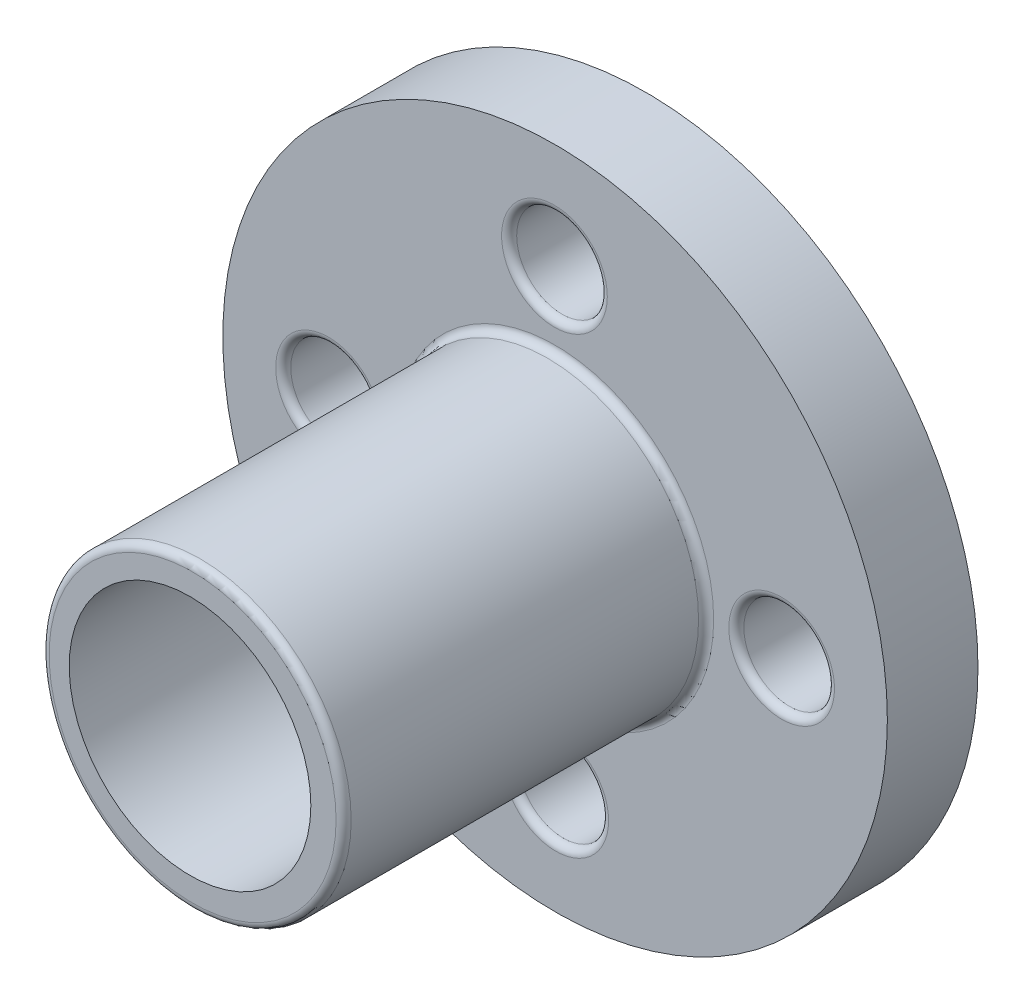
ISO-10303-21;
HEADER;
FILE_DESCRIPTION(('STEP AP214'),'2;1');
FILE_NAME('part.step','',(''),(''),'','','');
FILE_SCHEMA(('AUTOMOTIVE_DESIGN { 1 0 10303 214 1 1 1 1 }'));
ENDSEC;
DATA;
#1=APPLICATION_CONTEXT('core data for automotive mechanical design processes');
#2=APPLICATION_PROTOCOL_DEFINITION('international standard','automotive_design',2000,#1);
#3=PRODUCT_CONTEXT('',#1,'mechanical');
#4=PRODUCT('Part','Part','',(#3));
#5=PRODUCT_RELATED_PRODUCT_CATEGORY('part','',(#4));
#6=PRODUCT_DEFINITION_FORMATION('','',#4);
#7=PRODUCT_DEFINITION_CONTEXT('part definition',#1,'design');
#8=PRODUCT_DEFINITION('design','',#6,#7);
#9=PRODUCT_DEFINITION_SHAPE('','',#8);
#10=(LENGTH_UNIT() NAMED_UNIT(*) SI_UNIT(.MILLI.,.METRE.));
#11=(NAMED_UNIT(*) PLANE_ANGLE_UNIT() SI_UNIT($,.RADIAN.));
#12=(NAMED_UNIT(*) SI_UNIT($,.STERADIAN.) SOLID_ANGLE_UNIT());
#13=UNCERTAINTY_MEASURE_WITH_UNIT(LENGTH_MEASURE(1.E-05),#10,'distance_accuracy_value','');
#14=(GEOMETRIC_REPRESENTATION_CONTEXT(3) GLOBAL_UNCERTAINTY_ASSIGNED_CONTEXT((#13)) GLOBAL_UNIT_ASSIGNED_CONTEXT((#10,
#11,#12)) REPRESENTATION_CONTEXT('',''));
#15=CARTESIAN_POINT('',(0.,0.,0.));
#16=DIRECTION('',(0.,0.,1.));
#17=DIRECTION('',(1.,0.,0.));
#18=AXIS2_PLACEMENT_3D('',#15,#16,#17);
#19=CARTESIAN_POINT('',(0.,0.,3.));
#20=DIRECTION('',(0.,0.,-1.));
#21=DIRECTION('',(-1.,0.,0.));
#22=AXIS2_PLACEMENT_3D('',#19,#20,#21);
#23=CYLINDRICAL_SURFACE('',#22,11.);
#24=CARTESIAN_POINT('',(0.,0.,3.));
#25=DIRECTION('',(0.,0.,1.));
#26=DIRECTION('',(1.,0.,0.));
#27=AXIS2_PLACEMENT_3D('',#24,#25,#26);
#28=CIRCLE('',#27,11.);
#29=CARTESIAN_POINT('',(11.,0.,3.));
#30=VERTEX_POINT('',#29);
#31=EDGE_CURVE('E70',#30,#30,#28,.T.);
#32=ORIENTED_EDGE('',*,*,#31,.F.);
#33=EDGE_LOOP('',(#32));
#34=FACE_BOUND('',#33,.T.);
#35=CARTESIAN_POINT('',(0.,0.,0.));
#36=DIRECTION('',(0.,0.,1.));
#37=DIRECTION('',(1.,0.,0.));
#38=AXIS2_PLACEMENT_3D('',#35,#36,#37);
#39=CIRCLE('',#38,11.);
#40=CARTESIAN_POINT('',(11.,0.,0.));
#41=VERTEX_POINT('',#40);
#42=EDGE_CURVE('E78',#41,#41,#39,.T.);
#43=ORIENTED_EDGE('',*,*,#42,.T.);
#44=EDGE_LOOP('',(#43));
#45=FACE_BOUND('',#44,.T.);
#46=ADVANCED_FACE('F37',(#34,#45),#23,.T.);
#47=CARTESIAN_POINT('',(0.,0.,3.));
#48=DIRECTION('',(0.,0.,1.));
#49=DIRECTION('',(1.,0.,0.));
#50=AXIS2_PLACEMENT_3D('',#47,#48,#49);
#51=PLANE('',#50);
#52=CARTESIAN_POINT('',(0.,0.,3.));
#53=DIRECTION('',(0.,0.,1.));
#54=DIRECTION('',(1.,0.,0.));
#55=AXIS2_PLACEMENT_3D('',#52,#53,#54);
#56=CIRCLE('',#55,5.25);
#57=CARTESIAN_POINT('',(5.25,0.,3.));
#58=VERTEX_POINT('',#57);
#59=EDGE_CURVE('E11',#58,#58,#56,.F.);
#60=ORIENTED_EDGE('',*,*,#59,.T.);
#61=EDGE_LOOP('',(#60));
#62=FACE_BOUND('',#61,.T.);
#63=CARTESIAN_POINT('',(-7.49988498530789,-0.0214486722408623,3.));
#64=DIRECTION('',(0.,0.,1.));
#65=DIRECTION('',(1.,0.,0.));
#66=AXIS2_PLACEMENT_3D('',#63,#64,#65);
#67=CIRCLE('',#66,1.75000000000016);
#68=CARTESIAN_POINT('',(-5.74988498530772,-0.0214486722408623,3.));
#69=VERTEX_POINT('',#68);
#70=EDGE_CURVE('E89',#69,#69,#67,.F.);
#71=ORIENTED_EDGE('',*,*,#70,.T.);
#72=EDGE_LOOP('',(#71));
#73=FACE_BOUND('',#72,.T.);
#74=CARTESIAN_POINT('',(0.0214486722406514,-7.49988498530768,3.));
#75=DIRECTION('',(0.,0.,1.));
#76=DIRECTION('',(1.,0.,0.));
#77=AXIS2_PLACEMENT_3D('',#74,#75,#76);
#78=CIRCLE('',#77,1.75000000000045);
#79=CARTESIAN_POINT('',(1.7714486722411,-7.49988498530768,3.));
#80=VERTEX_POINT('',#79);
#81=EDGE_CURVE('E86',#80,#80,#78,.F.);
#82=ORIENTED_EDGE('',*,*,#81,.T.);
#83=EDGE_LOOP('',(#82));
#84=FACE_BOUND('',#83,.T.);
#85=CARTESIAN_POINT('',(7.49988498530747,0.0214486722408596,3.));
#86=DIRECTION('',(0.,0.,1.));
#87=DIRECTION('',(1.,0.,0.));
#88=AXIS2_PLACEMENT_3D('',#85,#86,#87);
#89=CIRCLE('',#88,1.75000000000034);
#90=CARTESIAN_POINT('',(9.24988498530781,0.0214486722408596,3.));
#91=VERTEX_POINT('',#90);
#92=EDGE_CURVE('E83',#91,#91,#89,.F.);
#93=ORIENTED_EDGE('',*,*,#92,.T.);
#94=EDGE_LOOP('',(#93));
#95=FACE_BOUND('',#94,.T.);
#96=CARTESIAN_POINT('',(-0.0214486722410713,7.49988498530768,3.));
#97=DIRECTION('',(0.,0.,1.));
#98=DIRECTION('',(1.,0.,0.));
#99=AXIS2_PLACEMENT_3D('',#96,#97,#98);
#100=CIRCLE('',#99,1.75);
#101=CARTESIAN_POINT('',(1.72855132775893,7.49988498530768,3.));
#102=VERTEX_POINT('',#101);
#103=EDGE_CURVE('E75',#102,#102,#100,.F.);
#104=ORIENTED_EDGE('',*,*,#103,.T.);
#105=EDGE_LOOP('',(#104));
#106=FACE_BOUND('',#105,.T.);
#107=ORIENTED_EDGE('',*,*,#31,.T.);
#108=EDGE_LOOP('',(#107));
#109=FACE_BOUND('',#108,.T.);
#110=ADVANCED_FACE('F122',(#62,#73,#84,#95,#106,#109),#51,.T.);
#111=CARTESIAN_POINT('',(0.,0.,0.));
#112=DIRECTION('',(0.,0.,1.));
#113=DIRECTION('',(1.,0.,0.));
#114=AXIS2_PLACEMENT_3D('',#111,#112,#113);
#115=PLANE('',#114);
#116=CARTESIAN_POINT('',(-0.0214486722410713,7.49988498530768,0.));
#117=DIRECTION('',(0.,0.,-1.));
#118=DIRECTION('',(-1.,0.,0.));
#119=AXIS2_PLACEMENT_3D('',#116,#117,#118);
#120=CIRCLE('',#119,1.5);
#121=CARTESIAN_POINT('',(-1.52144867224107,7.49988498530768,0.));
#122=VERTEX_POINT('',#121);
#123=EDGE_CURVE('E162',#122,#122,#120,.T.);
#124=ORIENTED_EDGE('',*,*,#123,.F.);
#125=EDGE_LOOP('',(#124));
#126=FACE_BOUND('',#125,.T.);
#127=CARTESIAN_POINT('',(-7.49988498530789,-0.0214486722408623,0.));
#128=DIRECTION('',(0.,0.,-1.));
#129=DIRECTION('',(-1.,0.,0.));
#130=AXIS2_PLACEMENT_3D('',#127,#128,#129);
#131=CIRCLE('',#130,1.50000000000016);
#132=CARTESIAN_POINT('',(-8.99988498530805,-0.0214486722408623,0.));
#133=VERTEX_POINT('',#132);
#134=EDGE_CURVE('E164',#133,#133,#131,.T.);
#135=ORIENTED_EDGE('',*,*,#134,.F.);
#136=EDGE_LOOP('',(#135));
#137=FACE_BOUND('',#136,.T.);
#138=CARTESIAN_POINT('',(0.0214486722406514,-7.49988498530768,0.));
#139=DIRECTION('',(0.,0.,-1.));
#140=DIRECTION('',(-1.,0.,0.));
#141=AXIS2_PLACEMENT_3D('',#138,#139,#140);
#142=CIRCLE('',#141,1.50000000000045);
#143=CARTESIAN_POINT('',(-1.4785513277598,-7.49988498530768,0.));
#144=VERTEX_POINT('',#143);
#145=EDGE_CURVE('E169',#144,#144,#142,.T.);
#146=ORIENTED_EDGE('',*,*,#145,.F.);
#147=EDGE_LOOP('',(#146));
#148=FACE_BOUND('',#147,.T.);
#149=CARTESIAN_POINT('',(7.49988498530747,0.0214486722408596,0.));
#150=DIRECTION('',(0.,0.,-1.));
#151=DIRECTION('',(-1.,0.,0.));
#152=AXIS2_PLACEMENT_3D('',#149,#150,#151);
#153=CIRCLE('',#152,1.50000000000034);
#154=CARTESIAN_POINT('',(5.99988498530713,0.0214486722408596,0.));
#155=VERTEX_POINT('',#154);
#156=EDGE_CURVE('E174',#155,#155,#153,.T.);
#157=ORIENTED_EDGE('',*,*,#156,.F.);
#158=EDGE_LOOP('',(#157));
#159=FACE_BOUND('',#158,.T.);
#160=CARTESIAN_POINT('',(0.,0.,0.));
#161=DIRECTION('',(0.,0.,-1.));
#162=DIRECTION('',(-1.,0.,0.));
#163=AXIS2_PLACEMENT_3D('',#160,#161,#162);
#164=CIRCLE('',#163,4.);
#165=CARTESIAN_POINT('',(-4.,0.,0.));
#166=VERTEX_POINT('',#165);
#167=EDGE_CURVE('E60',#166,#166,#164,.T.);
#168=ORIENTED_EDGE('',*,*,#167,.F.);
#169=EDGE_LOOP('',(#168));
#170=FACE_BOUND('',#169,.T.);
#171=ORIENTED_EDGE('',*,*,#42,.F.);
#172=EDGE_LOOP('',(#171));
#173=FACE_BOUND('',#172,.T.);
#174=ADVANCED_FACE('F128',(#126,#137,#148,#159,#170,#173),#115,.F.);
#175=CARTESIAN_POINT('',(0.,0.,15.));
#176=DIRECTION('',(0.,0.,1.));
#177=DIRECTION('',(1.,0.,0.));
#178=AXIS2_PLACEMENT_3D('',#175,#176,#177);
#179=PLANE('',#178);
#180=CARTESIAN_POINT('',(0.,0.,15.));
#181=DIRECTION('',(0.,0.,1.));
#182=DIRECTION('',(1.,0.,0.));
#183=AXIS2_PLACEMENT_3D('',#180,#181,#182);
#184=CIRCLE('',#183,4.75);
#185=CARTESIAN_POINT('',(4.75,0.,15.));
#186=VERTEX_POINT('',#185);
#187=EDGE_CURVE('E101',#186,#186,#184,.T.);
#188=ORIENTED_EDGE('',*,*,#187,.T.);
#189=EDGE_LOOP('',(#188));
#190=FACE_BOUND('',#189,.T.);
#191=CARTESIAN_POINT('',(-0.0857946889642851,0.,15.));
#192=DIRECTION('',(0.,0.,1.));
#193=DIRECTION('',(1.,0.,0.));
#194=AXIS2_PLACEMENT_3D('',#191,#192,#193);
#195=CIRCLE('',#194,4.);
#196=CARTESIAN_POINT('',(3.91420531103571,0.,15.));
#197=VERTEX_POINT('',#196);
#198=EDGE_CURVE('E66',#197,#197,#195,.T.);
#199=ORIENTED_EDGE('',*,*,#198,.F.);
#200=EDGE_LOOP('',(#199));
#201=FACE_BOUND('',#200,.T.);
#202=ADVANCED_FACE('F184',(#190,#201),#179,.T.);
#203=CARTESIAN_POINT('',(0.,0.,15.));
#204=DIRECTION('',(0.,0.,-1.));
#205=DIRECTION('',(-1.,0.,0.));
#206=AXIS2_PLACEMENT_3D('',#203,#204,#205);
#207=CYLINDRICAL_SURFACE('',#206,5.);
#208=CARTESIAN_POINT('',(0.,0.,3.25));
#209=DIRECTION('',(0.,0.,1.));
#210=DIRECTION('',(1.,0.,0.));
#211=AXIS2_PLACEMENT_3D('',#208,#209,#210);
#212=CIRCLE('',#211,5.);
#213=CARTESIAN_POINT('',(5.,0.,3.25));
#214=VERTEX_POINT('',#213);
#215=EDGE_CURVE('E45',#214,#214,#212,.T.);
#216=ORIENTED_EDGE('',*,*,#215,.T.);
#217=EDGE_LOOP('',(#216));
#218=FACE_BOUND('',#217,.T.);
#219=CARTESIAN_POINT('',(0.,0.,14.75));
#220=DIRECTION('',(0.,0.,1.));
#221=DIRECTION('',(1.,0.,0.));
#222=AXIS2_PLACEMENT_3D('',#219,#220,#221);
#223=CIRCLE('',#222,5.);
#224=CARTESIAN_POINT('',(5.,0.,14.75));
#225=VERTEX_POINT('',#224);
#226=EDGE_CURVE('E104',#225,#225,#223,.F.);
#227=ORIENTED_EDGE('',*,*,#226,.T.);
#228=EDGE_LOOP('',(#227));
#229=FACE_BOUND('',#228,.T.);
#230=ADVANCED_FACE('F109',(#218,#229),#207,.T.);
#231=CARTESIAN_POINT('',(-0.0857946889642851,0.,15.));
#232=DIRECTION('',(0.,0.,-1.));
#233=DIRECTION('',(-1.,0.,0.));
#234=AXIS2_PLACEMENT_3D('',#231,#232,#233);
#235=CYLINDRICAL_SURFACE('',#234,4.);
#236=ORIENTED_EDGE('',*,*,#198,.T.);
#237=EDGE_LOOP('',(#236));
#238=FACE_BOUND('',#237,.T.);
#239=CARTESIAN_POINT('',(-0.0857946889642851,0.,3.));
#240=DIRECTION('',(0.,0.,1.));
#241=DIRECTION('',(1.,0.,0.));
#242=AXIS2_PLACEMENT_3D('',#239,#240,#241);
#243=CIRCLE('',#242,4.);
#244=CARTESIAN_POINT('',(-0.0428973444821425,-3.99976997061536,3.));
#245=VERTEX_POINT('',#244);
#246=CARTESIAN_POINT('',(-0.0428973444821425,3.99976997061536,3.));
#247=VERTEX_POINT('',#246);
#248=EDGE_CURVE('E69',#245,#247,#243,.F.);
#249=ORIENTED_EDGE('',*,*,#248,.T.);
#250=EDGE_CURVE('E65',#247,#245,#243,.F.);
#251=ORIENTED_EDGE('',*,*,#250,.T.);
#252=EDGE_LOOP('',(#249,#251));
#253=FACE_BOUND('',#252,.T.);
#254=ADVANCED_FACE('F68',(#238,#253),#235,.F.);
#255=ORIENTED_EDGE('',*,*,#248,.F.);
#256=CARTESIAN_POINT('',(0.,0.,3.));
#257=DIRECTION('',(0.,0.,-1.));
#258=DIRECTION('',(-1.,0.,0.));
#259=AXIS2_PLACEMENT_3D('',#256,#257,#258);
#260=CIRCLE('',#259,4.);
#261=EDGE_CURVE('E54',#245,#247,#260,.T.);
#262=ORIENTED_EDGE('',*,*,#261,.T.);
#263=EDGE_LOOP('',(#255,#262));
#264=FACE_BOUND('',#263,.T.);
#265=ADVANCED_FACE('F72',(#264),#51,.T.);
#266=CARTESIAN_POINT('',(0.,0.,3.));
#267=DIRECTION('',(0.,0.,-1.));
#268=DIRECTION('',(-1.,0.,0.));
#269=AXIS2_PLACEMENT_3D('',#266,#267,#268);
#270=CYLINDRICAL_SURFACE('',#269,4.);
#271=EDGE_CURVE('E51',#247,#245,#260,.T.);
#272=ORIENTED_EDGE('',*,*,#271,.F.);
#273=ORIENTED_EDGE('',*,*,#261,.F.);
#274=EDGE_LOOP('',(#272,#273));
#275=FACE_BOUND('',#274,.T.);
#276=ORIENTED_EDGE('',*,*,#167,.T.);
#277=EDGE_LOOP('',(#276));
#278=FACE_BOUND('',#277,.T.);
#279=ADVANCED_FACE('F55',(#275,#278),#270,.F.);
#280=CARTESIAN_POINT('',(0.,0.,3.));
#281=DIRECTION('',(0.,0.,-1.));
#282=DIRECTION('',(-1.,0.,0.));
#283=AXIS2_PLACEMENT_3D('',#280,#281,#282);
#284=PLANE('',#283);
#285=ORIENTED_EDGE('',*,*,#271,.T.);
#286=ORIENTED_EDGE('',*,*,#250,.F.);
#287=EDGE_LOOP('',(#285,#286));
#288=FACE_BOUND('',#287,.T.);
#289=ADVANCED_FACE('F64',(#288),#284,.T.);
#290=CARTESIAN_POINT('',(7.49988498530747,0.0214486722408596,12.));
#291=DIRECTION('',(0.,0.,-1.));
#292=DIRECTION('',(-1.,0.,0.));
#293=AXIS2_PLACEMENT_3D('',#290,#291,#292);
#294=CYLINDRICAL_SURFACE('',#293,1.50000000000034);
#295=CARTESIAN_POINT('',(7.49988498530747,0.0214486722408596,2.75));
#296=DIRECTION('',(0.,0.,1.));
#297=DIRECTION('',(1.,0.,0.));
#298=AXIS2_PLACEMENT_3D('',#295,#296,#297);
#299=CIRCLE('',#298,1.50000000000034);
#300=CARTESIAN_POINT('',(8.99988498530781,0.0214486722408596,2.75));
#301=VERTEX_POINT('',#300);
#302=EDGE_CURVE('E95',#301,#301,#299,.T.);
#303=ORIENTED_EDGE('',*,*,#302,.T.);
#304=EDGE_LOOP('',(#303));
#305=FACE_BOUND('',#304,.T.);
#306=ORIENTED_EDGE('',*,*,#156,.T.);
#307=EDGE_LOOP('',(#306));
#308=FACE_BOUND('',#307,.T.);
#309=ADVANCED_FACE('F204',(#305,#308),#294,.F.);
#310=CARTESIAN_POINT('',(0.0214486722406514,-7.49988498530768,12.));
#311=DIRECTION('',(0.,0.,-1.));
#312=DIRECTION('',(-1.,0.,0.));
#313=AXIS2_PLACEMENT_3D('',#310,#311,#312);
#314=CYLINDRICAL_SURFACE('',#313,1.50000000000045);
#315=CARTESIAN_POINT('',(0.0214486722406514,-7.49988498530768,2.75));
#316=DIRECTION('',(0.,0.,1.));
#317=DIRECTION('',(1.,0.,0.));
#318=AXIS2_PLACEMENT_3D('',#315,#316,#317);
#319=CIRCLE('',#318,1.50000000000045);
#320=CARTESIAN_POINT('',(1.5214486722411,-7.49988498530768,2.75));
#321=VERTEX_POINT('',#320);
#322=EDGE_CURVE('E92',#321,#321,#319,.T.);
#323=ORIENTED_EDGE('',*,*,#322,.T.);
#324=EDGE_LOOP('',(#323));
#325=FACE_BOUND('',#324,.T.);
#326=ORIENTED_EDGE('',*,*,#145,.T.);
#327=EDGE_LOOP('',(#326));
#328=FACE_BOUND('',#327,.T.);
#329=ADVANCED_FACE('F250',(#325,#328),#314,.F.);
#330=CARTESIAN_POINT('',(-7.49988498530789,-0.0214486722408623,12.));
#331=DIRECTION('',(0.,0.,-1.));
#332=DIRECTION('',(-1.,0.,0.));
#333=AXIS2_PLACEMENT_3D('',#330,#331,#332);
#334=CYLINDRICAL_SURFACE('',#333,1.50000000000016);
#335=CARTESIAN_POINT('',(-7.49988498530789,-0.0214486722408623,2.75));
#336=DIRECTION('',(0.,0.,1.));
#337=DIRECTION('',(1.,0.,0.));
#338=AXIS2_PLACEMENT_3D('',#335,#336,#337);
#339=CIRCLE('',#338,1.50000000000016);
#340=CARTESIAN_POINT('',(-5.99988498530772,-0.0214486722408623,2.75));
#341=VERTEX_POINT('',#340);
#342=EDGE_CURVE('E73',#341,#341,#339,.T.);
#343=ORIENTED_EDGE('',*,*,#342,.T.);
#344=EDGE_LOOP('',(#343));
#345=FACE_BOUND('',#344,.T.);
#346=ORIENTED_EDGE('',*,*,#134,.T.);
#347=EDGE_LOOP('',(#346));
#348=FACE_BOUND('',#347,.T.);
#349=ADVANCED_FACE('F158',(#345,#348),#334,.F.);
#350=CARTESIAN_POINT('',(-0.0214486722410713,7.49988498530768,12.));
#351=DIRECTION('',(0.,0.,-1.));
#352=DIRECTION('',(-1.,0.,0.));
#353=AXIS2_PLACEMENT_3D('',#350,#351,#352);
#354=CYLINDRICAL_SURFACE('',#353,1.5);
#355=CARTESIAN_POINT('',(-0.0214486722410713,7.49988498530768,2.75));
#356=DIRECTION('',(0.,0.,1.));
#357=DIRECTION('',(1.,0.,0.));
#358=AXIS2_PLACEMENT_3D('',#355,#356,#357);
#359=CIRCLE('',#358,1.5);
#360=CARTESIAN_POINT('',(1.47855132775893,7.49988498530768,2.75));
#361=VERTEX_POINT('',#360);
#362=EDGE_CURVE('E98',#361,#361,#359,.T.);
#363=ORIENTED_EDGE('',*,*,#362,.T.);
#364=EDGE_LOOP('',(#363));
#365=FACE_BOUND('',#364,.T.);
#366=ORIENTED_EDGE('',*,*,#123,.T.);
#367=EDGE_LOOP('',(#366));
#368=FACE_BOUND('',#367,.T.);
#369=ADVANCED_FACE('F139',(#365,#368),#354,.F.);
#370=CARTESIAN_POINT('',(-7.49988498530789,-0.0214486722408623,2.75));
#371=DIRECTION('',(0.,0.,1.));
#372=DIRECTION('',(1.,0.,0.));
#373=AXIS2_PLACEMENT_3D('',#370,#371,#372);
#374=TOROIDAL_SURFACE('',#373,1.75000000000016,0.25);
#375=ORIENTED_EDGE('',*,*,#70,.F.);
#376=EDGE_LOOP('',(#375));
#377=FACE_BOUND('',#376,.T.);
#378=ORIENTED_EDGE('',*,*,#342,.F.);
#379=EDGE_LOOP('',(#378));
#380=FACE_BOUND('',#379,.T.);
#381=ADVANCED_FACE('F135',(#377,#380),#374,.T.);
#382=CARTESIAN_POINT('',(0.0214486722406514,-7.49988498530768,2.75));
#383=DIRECTION('',(0.,0.,1.));
#384=DIRECTION('',(1.,0.,0.));
#385=AXIS2_PLACEMENT_3D('',#382,#383,#384);
#386=TOROIDAL_SURFACE('',#385,1.75000000000045,0.25);
#387=ORIENTED_EDGE('',*,*,#81,.F.);
#388=EDGE_LOOP('',(#387));
#389=FACE_BOUND('',#388,.T.);
#390=ORIENTED_EDGE('',*,*,#322,.F.);
#391=EDGE_LOOP('',(#390));
#392=FACE_BOUND('',#391,.T.);
#393=ADVANCED_FACE('F138',(#389,#392),#386,.T.);
#394=CARTESIAN_POINT('',(7.49988498530747,0.0214486722408596,2.75));
#395=DIRECTION('',(0.,0.,1.));
#396=DIRECTION('',(1.,0.,0.));
#397=AXIS2_PLACEMENT_3D('',#394,#395,#396);
#398=TOROIDAL_SURFACE('',#397,1.75000000000034,0.25);
#399=ORIENTED_EDGE('',*,*,#92,.F.);
#400=EDGE_LOOP('',(#399));
#401=FACE_BOUND('',#400,.T.);
#402=ORIENTED_EDGE('',*,*,#302,.F.);
#403=EDGE_LOOP('',(#402));
#404=FACE_BOUND('',#403,.T.);
#405=ADVANCED_FACE('F143',(#401,#404),#398,.T.);
#406=CARTESIAN_POINT('',(-0.0214486722410713,7.49988498530768,2.75));
#407=DIRECTION('',(0.,0.,1.));
#408=DIRECTION('',(1.,0.,0.));
#409=AXIS2_PLACEMENT_3D('',#406,#407,#408);
#410=TOROIDAL_SURFACE('',#409,1.75,0.25);
#411=ORIENTED_EDGE('',*,*,#103,.F.);
#412=EDGE_LOOP('',(#411));
#413=FACE_BOUND('',#412,.T.);
#414=ORIENTED_EDGE('',*,*,#362,.F.);
#415=EDGE_LOOP('',(#414));
#416=FACE_BOUND('',#415,.T.);
#417=ADVANCED_FACE('F118',(#413,#416),#410,.T.);
#418=CARTESIAN_POINT('',(0.,0.,14.75));
#419=DIRECTION('',(0.,0.,1.));
#420=DIRECTION('',(1.,0.,0.));
#421=AXIS2_PLACEMENT_3D('',#418,#419,#420);
#422=TOROIDAL_SURFACE('',#421,4.75,0.25);
#423=ORIENTED_EDGE('',*,*,#226,.F.);
#424=EDGE_LOOP('',(#423));
#425=FACE_BOUND('',#424,.T.);
#426=ORIENTED_EDGE('',*,*,#187,.F.);
#427=EDGE_LOOP('',(#426));
#428=FACE_BOUND('',#427,.T.);
#429=ADVANCED_FACE('F113',(#425,#428),#422,.T.);
#430=CARTESIAN_POINT('',(0.,0.,3.25));
#431=DIRECTION('',(0.,0.,1.));
#432=DIRECTION('',(1.,0.,0.));
#433=AXIS2_PLACEMENT_3D('',#430,#431,#432);
#434=TOROIDAL_SURFACE('',#433,5.25,0.25);
#435=ORIENTED_EDGE('',*,*,#59,.F.);
#436=EDGE_LOOP('',(#435));
#437=FACE_BOUND('',#436,.T.);
#438=ORIENTED_EDGE('',*,*,#215,.F.);
#439=EDGE_LOOP('',(#438));
#440=FACE_BOUND('',#439,.T.);
#441=ADVANCED_FACE('F39',(#437,#440),#434,.F.);
#442=CLOSED_SHELL('',(#46,#110,#174,#202,#230,#254,#265,#279,#289,#309,#329,#349,#369,#381,#393,
#405,#417,#429,#441));
#443=MANIFOLD_SOLID_BREP('B2',#442);
#444=ADVANCED_BREP_SHAPE_REPRESENTATION('',(#18,#443),#14);
#445=SHAPE_DEFINITION_REPRESENTATION(#9,#444);
ENDSEC;
END-ISO-10303-21;
